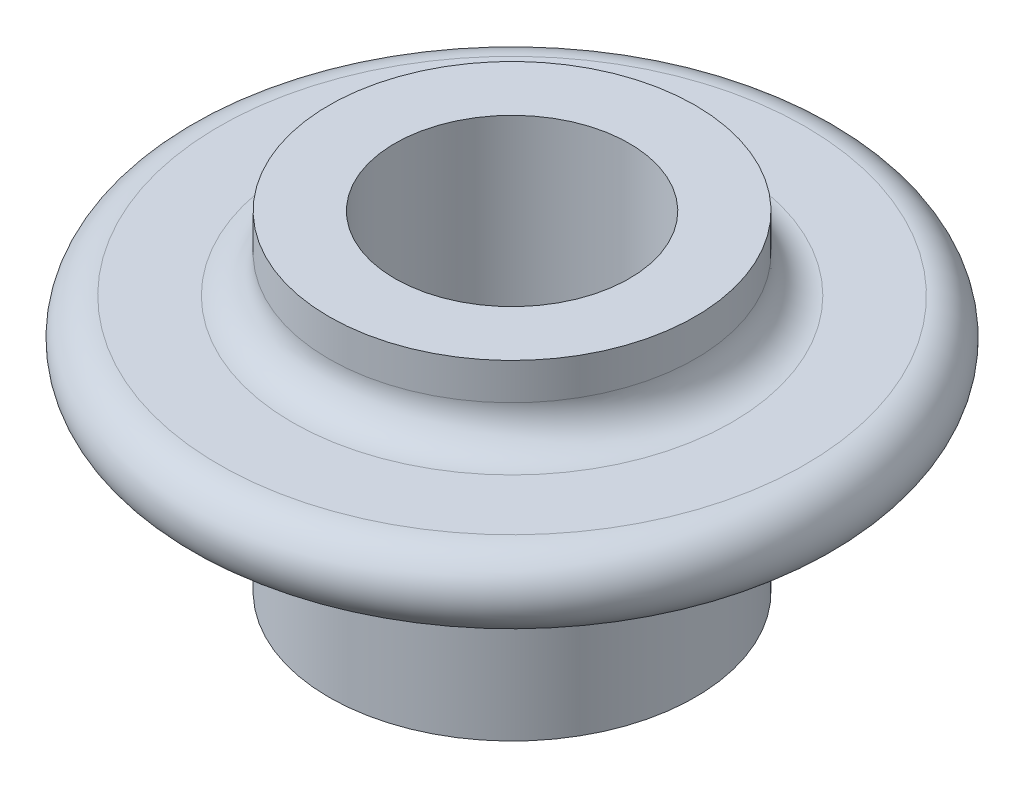
ISO-10303-21;
HEADER;
FILE_DESCRIPTION(('STEP AP214'),'2;1');
FILE_NAME('part.step','',(''),(''),'','','');
FILE_SCHEMA(('AUTOMOTIVE_DESIGN { 1 0 10303 214 1 1 1 1 }'));
ENDSEC;
DATA;
#1=APPLICATION_CONTEXT('core data for automotive mechanical design processes');
#2=APPLICATION_PROTOCOL_DEFINITION('international standard','automotive_design',2000,#1);
#3=PRODUCT_CONTEXT('',#1,'mechanical');
#4=PRODUCT('Part','Part','',(#3));
#5=PRODUCT_RELATED_PRODUCT_CATEGORY('part','',(#4));
#6=PRODUCT_DEFINITION_FORMATION('','',#4);
#7=PRODUCT_DEFINITION_CONTEXT('part definition',#1,'design');
#8=PRODUCT_DEFINITION('design','',#6,#7);
#9=PRODUCT_DEFINITION_SHAPE('','',#8);
#10=(LENGTH_UNIT() NAMED_UNIT(*) SI_UNIT(.MILLI.,.METRE.));
#11=(NAMED_UNIT(*) PLANE_ANGLE_UNIT() SI_UNIT($,.RADIAN.));
#12=(NAMED_UNIT(*) SI_UNIT($,.STERADIAN.) SOLID_ANGLE_UNIT());
#13=UNCERTAINTY_MEASURE_WITH_UNIT(LENGTH_MEASURE(1.E-05),#10,'distance_accuracy_value','');
#14=(GEOMETRIC_REPRESENTATION_CONTEXT(3) GLOBAL_UNCERTAINTY_ASSIGNED_CONTEXT((#13)) GLOBAL_UNIT_ASSIGNED_CONTEXT((#10,
#11,#12)) REPRESENTATION_CONTEXT('',''));
#15=CARTESIAN_POINT('',(0.,0.,0.));
#16=DIRECTION('',(0.,0.,1.));
#17=DIRECTION('',(1.,0.,0.));
#18=AXIS2_PLACEMENT_3D('',#15,#16,#17);
#19=CARTESIAN_POINT('',(25.,0.,0.));
#20=DIRECTION('',(0.,-1.,0.));
#21=DIRECTION('',(0.,0.,-1.));
#22=AXIS2_PLACEMENT_3D('',#19,#20,#21);
#23=PLANE('',#22);
#24=CARTESIAN_POINT('',(0.,0.,0.));
#25=DIRECTION('',(0.,1.,0.));
#26=DIRECTION('',(0.,0.,1.));
#27=AXIS2_PLACEMENT_3D('',#24,#25,#26);
#28=CIRCLE('',#27,16.);
#29=CARTESIAN_POINT('',(0.,0.,16.));
#30=VERTEX_POINT('',#29);
#31=EDGE_CURVE('E69',#30,#30,#28,.T.);
#32=ORIENTED_EDGE('',*,*,#31,.T.);
#33=EDGE_LOOP('',(#32));
#34=FACE_BOUND('',#33,.T.);
#35=CARTESIAN_POINT('',(0.,0.,0.));
#36=DIRECTION('',(0.,-1.,0.));
#37=DIRECTION('',(0.,0.,-1.));
#38=AXIS2_PLACEMENT_3D('',#35,#36,#37);
#39=CIRCLE('',#38,25.);
#40=CARTESIAN_POINT('',(0.,0.,-25.));
#41=VERTEX_POINT('',#40);
#42=EDGE_CURVE('E66',#41,#41,#39,.T.);
#43=ORIENTED_EDGE('',*,*,#42,.T.);
#44=EDGE_LOOP('',(#43));
#45=FACE_BOUND('',#44,.T.);
#46=ADVANCED_FACE('F37',(#34,#45),#23,.T.);
#47=CARTESIAN_POINT('',(0.,45.,0.));
#48=DIRECTION('',(0.,1.,0.));
#49=DIRECTION('',(0.,0.,1.));
#50=AXIS2_PLACEMENT_3D('',#47,#48,#49);
#51=PLANE('',#50);
#52=CARTESIAN_POINT('',(0.,45.,0.));
#53=DIRECTION('',(0.,1.,0.));
#54=DIRECTION('',(0.,0.,1.));
#55=AXIS2_PLACEMENT_3D('',#52,#53,#54);
#56=CIRCLE('',#55,16.);
#57=CARTESIAN_POINT('',(0.,45.,16.));
#58=VERTEX_POINT('',#57);
#59=EDGE_CURVE('E72',#58,#58,#56,.T.);
#60=ORIENTED_EDGE('',*,*,#59,.F.);
#61=EDGE_LOOP('',(#60));
#62=FACE_BOUND('',#61,.T.);
#63=CARTESIAN_POINT('',(0.,45.,0.));
#64=DIRECTION('',(0.,-1.,0.));
#65=DIRECTION('',(0.,0.,-1.));
#66=AXIS2_PLACEMENT_3D('',#63,#64,#65);
#67=CIRCLE('',#66,25.);
#68=CARTESIAN_POINT('',(0.,45.,-25.));
#69=VERTEX_POINT('',#68);
#70=EDGE_CURVE('E57',#69,#69,#67,.T.);
#71=ORIENTED_EDGE('',*,*,#70,.F.);
#72=EDGE_LOOP('',(#71));
#73=FACE_BOUND('',#72,.T.);
#74=ADVANCED_FACE('F78',(#62,#73),#51,.T.);
#75=CARTESIAN_POINT('',(0.,0.,0.));
#76=DIRECTION('',(0.,-1.,0.));
#77=DIRECTION('',(0.,0.,-1.));
#78=AXIS2_PLACEMENT_3D('',#75,#76,#77);
#79=CYLINDRICAL_SURFACE('',#78,25.);
#80=CARTESIAN_POINT('',(0.,40.,0.));
#81=DIRECTION('',(0.,1.,0.));
#82=DIRECTION('',(0.,0.,1.));
#83=AXIS2_PLACEMENT_3D('',#80,#81,#82);
#84=CIRCLE('',#83,25.);
#85=CARTESIAN_POINT('',(0.,40.,25.));
#86=VERTEX_POINT('',#85);
#87=EDGE_CURVE('E48',#86,#86,#84,.T.);
#88=ORIENTED_EDGE('',*,*,#87,.T.);
#89=EDGE_LOOP('',(#88));
#90=FACE_BOUND('',#89,.T.);
#91=ORIENTED_EDGE('',*,*,#70,.T.);
#92=EDGE_LOOP('',(#91));
#93=FACE_BOUND('',#92,.T.);
#94=ADVANCED_FACE('F81',(#90,#93),#79,.T.);
#95=CARTESIAN_POINT('',(25.,35.,0.));
#96=DIRECTION('',(0.,1.,0.));
#97=DIRECTION('',(0.,0.,1.));
#98=AXIS2_PLACEMENT_3D('',#95,#96,#97);
#99=PLANE('',#98);
#100=CARTESIAN_POINT('',(0.,35.,0.));
#101=DIRECTION('',(0.,1.,0.));
#102=DIRECTION('',(0.,0.,1.));
#103=AXIS2_PLACEMENT_3D('',#100,#101,#102);
#104=CIRCLE('',#103,30.);
#105=CARTESIAN_POINT('',(0.,35.,30.));
#106=VERTEX_POINT('',#105);
#107=EDGE_CURVE('E52',#106,#106,#104,.F.);
#108=ORIENTED_EDGE('',*,*,#107,.T.);
#109=EDGE_LOOP('',(#108));
#110=FACE_BOUND('',#109,.T.);
#111=CARTESIAN_POINT('',(0.,35.,0.));
#112=DIRECTION('',(0.,-1.,0.));
#113=DIRECTION('',(0.,0.,-1.));
#114=AXIS2_PLACEMENT_3D('',#111,#112,#113);
#115=CIRCLE('',#114,40.);
#116=CARTESIAN_POINT('',(0.,35.,-40.));
#117=VERTEX_POINT('',#116);
#118=EDGE_CURVE('E60',#117,#117,#115,.T.);
#119=ORIENTED_EDGE('',*,*,#118,.F.);
#120=EDGE_LOOP('',(#119));
#121=FACE_BOUND('',#120,.T.);
#122=ADVANCED_FACE('F86',(#110,#121),#99,.T.);
#123=CARTESIAN_POINT('',(0.,30.,0.));
#124=DIRECTION('',(0.,-1.,0.));
#125=DIRECTION('',(0.,0.,-1.));
#126=AXIS2_PLACEMENT_3D('',#123,#124,#125);
#127=TOROIDAL_SURFACE('',#126,40.,5.);
#128=ORIENTED_EDGE('',*,*,#118,.T.);
#129=EDGE_LOOP('',(#128));
#130=FACE_BOUND('',#129,.T.);
#131=CARTESIAN_POINT('',(0.,25.,0.));
#132=DIRECTION('',(0.,-1.,0.));
#133=DIRECTION('',(0.,0.,-1.));
#134=AXIS2_PLACEMENT_3D('',#131,#132,#133);
#135=CIRCLE('',#134,40.);
#136=CARTESIAN_POINT('',(0.,25.,-40.));
#137=VERTEX_POINT('',#136);
#138=EDGE_CURVE('E63',#137,#137,#135,.T.);
#139=ORIENTED_EDGE('',*,*,#138,.F.);
#140=EDGE_LOOP('',(#139));
#141=FACE_BOUND('',#140,.T.);
#142=ADVANCED_FACE('F93',(#130,#141),#127,.T.);
#143=CARTESIAN_POINT('',(40.,25.,0.));
#144=DIRECTION('',(0.,-1.,0.));
#145=DIRECTION('',(0.,0.,-1.));
#146=AXIS2_PLACEMENT_3D('',#143,#144,#145);
#147=PLANE('',#146);
#148=CARTESIAN_POINT('',(0.,25.,0.));
#149=DIRECTION('',(0.,-1.,0.));
#150=DIRECTION('',(0.,0.,-1.));
#151=AXIS2_PLACEMENT_3D('',#148,#149,#150);
#152=CIRCLE('',#151,26.);
#153=CARTESIAN_POINT('',(0.,25.,-26.));
#154=VERTEX_POINT('',#153);
#155=EDGE_CURVE('E10',#154,#154,#152,.F.);
#156=ORIENTED_EDGE('',*,*,#155,.T.);
#157=EDGE_LOOP('',(#156));
#158=FACE_BOUND('',#157,.T.);
#159=ORIENTED_EDGE('',*,*,#138,.T.);
#160=EDGE_LOOP('',(#159));
#161=FACE_BOUND('',#160,.T.);
#162=ADVANCED_FACE('F122',(#158,#161),#147,.T.);
#163=CARTESIAN_POINT('',(0.,0.,0.));
#164=DIRECTION('',(0.,-1.,0.));
#165=DIRECTION('',(0.,0.,-1.));
#166=AXIS2_PLACEMENT_3D('',#163,#164,#165);
#167=CYLINDRICAL_SURFACE('',#166,25.);
#168=CARTESIAN_POINT('',(0.,24.,0.));
#169=DIRECTION('',(0.,-1.,0.));
#170=DIRECTION('',(0.,0.,-1.));
#171=AXIS2_PLACEMENT_3D('',#168,#169,#170);
#172=CIRCLE('',#171,25.);
#173=CARTESIAN_POINT('',(0.,24.,-25.));
#174=VERTEX_POINT('',#173);
#175=EDGE_CURVE('E44',#174,#174,#172,.T.);
#176=ORIENTED_EDGE('',*,*,#175,.T.);
#177=EDGE_LOOP('',(#176));
#178=FACE_BOUND('',#177,.T.);
#179=ORIENTED_EDGE('',*,*,#42,.F.);
#180=EDGE_LOOP('',(#179));
#181=FACE_BOUND('',#180,.T.);
#182=ADVANCED_FACE('F111',(#178,#181),#167,.T.);
#183=CARTESIAN_POINT('',(0.,45.,0.));
#184=DIRECTION('',(0.,1.,0.));
#185=DIRECTION('',(0.,0.,1.));
#186=AXIS2_PLACEMENT_3D('',#183,#184,#185);
#187=CYLINDRICAL_SURFACE('',#186,16.);
#188=ORIENTED_EDGE('',*,*,#31,.F.);
#189=EDGE_LOOP('',(#188));
#190=FACE_BOUND('',#189,.T.);
#191=ORIENTED_EDGE('',*,*,#59,.T.);
#192=EDGE_LOOP('',(#191));
#193=FACE_BOUND('',#192,.T.);
#194=ADVANCED_FACE('F76',(#190,#193),#187,.F.);
#195=CARTESIAN_POINT('',(0.,40.,0.));
#196=DIRECTION('',(0.,1.,0.));
#197=DIRECTION('',(0.,0.,1.));
#198=AXIS2_PLACEMENT_3D('',#195,#196,#197);
#199=TOROIDAL_SURFACE('',#198,30.,5.);
#200=ORIENTED_EDGE('',*,*,#87,.F.);
#201=EDGE_LOOP('',(#200));
#202=FACE_BOUND('',#201,.T.);
#203=ORIENTED_EDGE('',*,*,#107,.F.);
#204=EDGE_LOOP('',(#203));
#205=FACE_BOUND('',#204,.T.);
#206=ADVANCED_FACE('F102',(#202,#205),#199,.F.);
#207=CARTESIAN_POINT('',(0.,24.,0.));
#208=DIRECTION('',(0.,-1.,0.));
#209=DIRECTION('',(0.,0.,-1.));
#210=AXIS2_PLACEMENT_3D('',#207,#208,#209);
#211=TOROIDAL_SURFACE('',#210,26.,1.);
#212=ORIENTED_EDGE('',*,*,#155,.F.);
#213=EDGE_LOOP('',(#212));
#214=FACE_BOUND('',#213,.T.);
#215=ORIENTED_EDGE('',*,*,#175,.F.);
#216=EDGE_LOOP('',(#215));
#217=FACE_BOUND('',#216,.T.);
#218=ADVANCED_FACE('F39',(#214,#217),#211,.F.);
#219=CLOSED_SHELL('',(#46,#74,#94,#122,#142,#162,#182,#194,#206,#218));
#220=MANIFOLD_SOLID_BREP('B2',#219);
#221=ADVANCED_BREP_SHAPE_REPRESENTATION('',(#18,#220),#14);
#222=SHAPE_DEFINITION_REPRESENTATION(#9,#221);
ENDSEC;
END-ISO-10303-21;
